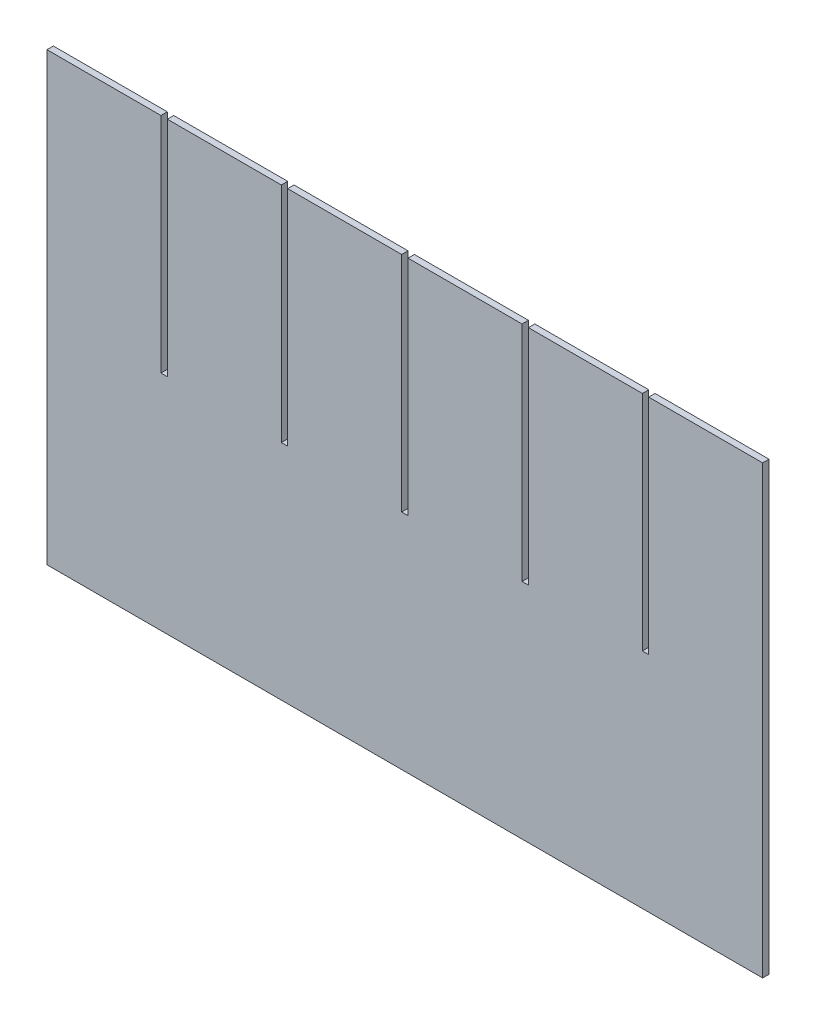
ISO-10303-21;
HEADER;
FILE_DESCRIPTION(('STEP AP214'),'2;1');
FILE_NAME('part.step','',(''),(''),'','','');
FILE_SCHEMA(('AUTOMOTIVE_DESIGN { 1 0 10303 214 1 1 1 1 }'));
ENDSEC;
DATA;
#1=APPLICATION_CONTEXT('core data for automotive mechanical design processes');
#2=APPLICATION_PROTOCOL_DEFINITION('international standard','automotive_design',2000,#1);
#3=PRODUCT_CONTEXT('',#1,'mechanical');
#4=PRODUCT('Part','Part','',(#3));
#5=PRODUCT_RELATED_PRODUCT_CATEGORY('part','',(#4));
#6=PRODUCT_DEFINITION_FORMATION('','',#4);
#7=PRODUCT_DEFINITION_CONTEXT('part definition',#1,'design');
#8=PRODUCT_DEFINITION('design','',#6,#7);
#9=PRODUCT_DEFINITION_SHAPE('','',#8);
#10=(LENGTH_UNIT() NAMED_UNIT(*) SI_UNIT(.MILLI.,.METRE.));
#11=(NAMED_UNIT(*) PLANE_ANGLE_UNIT() SI_UNIT($,.RADIAN.));
#12=(NAMED_UNIT(*) SI_UNIT($,.STERADIAN.) SOLID_ANGLE_UNIT());
#13=UNCERTAINTY_MEASURE_WITH_UNIT(LENGTH_MEASURE(1.E-05),#10,'distance_accuracy_value','');
#14=(GEOMETRIC_REPRESENTATION_CONTEXT(3) GLOBAL_UNCERTAINTY_ASSIGNED_CONTEXT((#13)) GLOBAL_UNIT_ASSIGNED_CONTEXT((#10,
#11,#12)) REPRESENTATION_CONTEXT('',''));
#15=CARTESIAN_POINT('',(0.,0.,0.));
#16=DIRECTION('',(0.,0.,1.));
#17=DIRECTION('',(1.,0.,0.));
#18=AXIS2_PLACEMENT_3D('',#15,#16,#17);
#19=CARTESIAN_POINT('',(-112.3,70.,2.));
#20=DIRECTION('',(0.,-1.,0.));
#21=DIRECTION('',(0.,0.,-1.));
#22=AXIS2_PLACEMENT_3D('',#19,#20,#21);
#23=PLANE('',#22);
#24=DIRECTION('',(0.,0.,1.));
#25=VECTOR('',#24,1.);
#26=CARTESIAN_POINT('',(-36.76,70.,0.));
#27=LINE('',#26,#25);
#28=CARTESIAN_POINT('',(-36.76,70.,0.));
#29=VERTEX_POINT('',#28);
#30=CARTESIAN_POINT('',(-36.76,70.,2.));
#31=VERTEX_POINT('',#30);
#32=EDGE_CURVE('E195',#29,#31,#27,.T.);
#33=ORIENTED_EDGE('',*,*,#32,.T.);
#34=DIRECTION('',(-1.,0.,0.));
#35=VECTOR('',#34,1.);
#36=CARTESIAN_POINT('',(-112.3,70.,2.));
#37=LINE('',#36,#35);
#38=CARTESIAN_POINT('',(-0.990000000000012,70.,2.));
#39=VERTEX_POINT('',#38);
#40=EDGE_CURVE('E404',#39,#31,#37,.T.);
#41=ORIENTED_EDGE('',*,*,#40,.F.);
#42=DIRECTION('',(0.,0.,1.));
#43=VECTOR('',#42,1.);
#44=CARTESIAN_POINT('',(-0.990000000000012,70.,0.));
#45=LINE('',#44,#43);
#46=CARTESIAN_POINT('',(-0.990000000000012,70.,0.));
#47=VERTEX_POINT('',#46);
#48=EDGE_CURVE('E217',#47,#39,#45,.T.);
#49=ORIENTED_EDGE('',*,*,#48,.F.);
#50=DIRECTION('',(-1.,0.,0.));
#51=VECTOR('',#50,1.);
#52=CARTESIAN_POINT('',(-112.3,70.,0.));
#53=LINE('',#52,#51);
#54=EDGE_CURVE('E211',#47,#29,#53,.T.);
#55=ORIENTED_EDGE('',*,*,#54,.T.);
#56=EDGE_LOOP('',(#33,#41,#49,#55));
#57=FACE_BOUND('',#56,.T.);
#58=ADVANCED_FACE('F33',(#57),#23,.F.);
#59=DIRECTION('',(0.,0.,1.));
#60=VECTOR('',#59,1.);
#61=CARTESIAN_POINT('',(1.00999999999999,70.,0.));
#62=LINE('',#61,#60);
#63=CARTESIAN_POINT('',(1.00999999999999,70.,0.));
#64=VERTEX_POINT('',#63);
#65=CARTESIAN_POINT('',(1.00999999999999,70.,2.));
#66=VERTEX_POINT('',#65);
#67=EDGE_CURVE('E365',#64,#66,#62,.T.);
#68=ORIENTED_EDGE('',*,*,#67,.T.);
#69=CARTESIAN_POINT('',(36.78,70.,2.));
#70=VERTEX_POINT('',#69);
#71=EDGE_CURVE('E405',#70,#66,#37,.T.);
#72=ORIENTED_EDGE('',*,*,#71,.F.);
#73=DIRECTION('',(0.,0.,1.));
#74=VECTOR('',#73,1.);
#75=CARTESIAN_POINT('',(36.78,70.,0.));
#76=LINE('',#75,#74);
#77=CARTESIAN_POINT('',(36.78,70.,0.));
#78=VERTEX_POINT('',#77);
#79=EDGE_CURVE('E314',#78,#70,#76,.T.);
#80=ORIENTED_EDGE('',*,*,#79,.F.);
#81=EDGE_CURVE('E218',#78,#64,#53,.T.);
#82=ORIENTED_EDGE('',*,*,#81,.T.);
#83=EDGE_LOOP('',(#68,#72,#80,#82));
#84=FACE_BOUND('',#83,.T.);
#85=ADVANCED_FACE('F430',(#84),#23,.F.);
#86=DIRECTION('',(0.,0.,1.));
#87=VECTOR('',#86,1.);
#88=CARTESIAN_POINT('',(76.55,70.,0.));
#89=LINE('',#88,#87);
#90=CARTESIAN_POINT('',(76.55,70.,0.));
#91=VERTEX_POINT('',#90);
#92=CARTESIAN_POINT('',(76.55,70.,2.));
#93=VERTEX_POINT('',#92);
#94=EDGE_CURVE('E339',#91,#93,#89,.T.);
#95=ORIENTED_EDGE('',*,*,#94,.T.);
#96=CARTESIAN_POINT('',(112.3,70.,2.));
#97=VERTEX_POINT('',#96);
#98=EDGE_CURVE('E270',#97,#93,#37,.T.);
#99=ORIENTED_EDGE('',*,*,#98,.F.);
#100=DIRECTION('',(0.,0.,-1.));
#101=VECTOR('',#100,1.);
#102=CARTESIAN_POINT('',(112.3,70.,2.));
#103=LINE('',#102,#101);
#104=CARTESIAN_POINT('',(112.3,70.,0.));
#105=VERTEX_POINT('',#104);
#106=EDGE_CURVE('E11',#97,#105,#103,.T.);
#107=ORIENTED_EDGE('',*,*,#106,.T.);
#108=EDGE_CURVE('E224',#105,#91,#53,.T.);
#109=ORIENTED_EDGE('',*,*,#108,.T.);
#110=EDGE_LOOP('',(#95,#99,#107,#109));
#111=FACE_BOUND('',#110,.T.);
#112=ADVANCED_FACE('F455',(#111),#23,.F.);
#113=CARTESIAN_POINT('',(74.55,70.,2.));
#114=VERTEX_POINT('',#113);
#115=CARTESIAN_POINT('',(38.78,70.,2.));
#116=VERTEX_POINT('',#115);
#117=EDGE_CURVE('E271',#114,#116,#37,.T.);
#118=ORIENTED_EDGE('',*,*,#117,.F.);
#119=DIRECTION('',(0.,0.,1.));
#120=VECTOR('',#119,1.);
#121=CARTESIAN_POINT('',(74.55,70.,0.));
#122=LINE('',#121,#120);
#123=CARTESIAN_POINT('',(74.55,70.,0.));
#124=VERTEX_POINT('',#123);
#125=EDGE_CURVE('E342',#124,#114,#122,.T.);
#126=ORIENTED_EDGE('',*,*,#125,.F.);
#127=CARTESIAN_POINT('',(38.78,70.,0.));
#128=VERTEX_POINT('',#127);
#129=EDGE_CURVE('E222',#124,#128,#53,.T.);
#130=ORIENTED_EDGE('',*,*,#129,.T.);
#131=DIRECTION('',(0.,0.,1.));
#132=VECTOR('',#131,1.);
#133=CARTESIAN_POINT('',(38.78,70.,0.));
#134=LINE('',#133,#132);
#135=EDGE_CURVE('E311',#128,#116,#134,.T.);
#136=ORIENTED_EDGE('',*,*,#135,.T.);
#137=EDGE_LOOP('',(#118,#126,#130,#136));
#138=FACE_BOUND('',#137,.T.);
#139=ADVANCED_FACE('F417',(#138),#23,.F.);
#140=CARTESIAN_POINT('',(0.,0.,2.));
#141=DIRECTION('',(0.,0.,-1.));
#142=DIRECTION('',(-1.,0.,0.));
#143=AXIS2_PLACEMENT_3D('',#140,#141,#142);
#144=PLANE('',#143);
#145=DIRECTION('',(0.,-1.,0.));
#146=VECTOR('',#145,1.);
#147=CARTESIAN_POINT('',(-36.76,0.,2.));
#148=LINE('',#147,#146);
#149=CARTESIAN_POINT('',(-36.76,0.,2.));
#150=VERTEX_POINT('',#149);
#151=EDGE_CURVE('E200',#31,#150,#148,.T.);
#152=ORIENTED_EDGE('',*,*,#151,.T.);
#153=DIRECTION('',(1.,0.,0.));
#154=VECTOR('',#153,1.);
#155=CARTESIAN_POINT('',(0.,0.,2.));
#156=LINE('',#155,#154);
#157=CARTESIAN_POINT('',(-38.76,0.,2.));
#158=VERTEX_POINT('',#157);
#159=EDGE_CURVE('E214',#158,#150,#156,.T.);
#160=ORIENTED_EDGE('',*,*,#159,.F.);
#161=DIRECTION('',(0.,-1.,0.));
#162=VECTOR('',#161,1.);
#163=CARTESIAN_POINT('',(-38.76,0.,2.));
#164=LINE('',#163,#162);
#165=CARTESIAN_POINT('',(-38.76,70.,2.));
#166=VERTEX_POINT('',#165);
#167=EDGE_CURVE('E388',#166,#158,#164,.T.);
#168=ORIENTED_EDGE('',*,*,#167,.F.);
#169=CARTESIAN_POINT('',(-74.53,70.,2.));
#170=VERTEX_POINT('',#169);
#171=EDGE_CURVE('E268',#166,#170,#37,.T.);
#172=ORIENTED_EDGE('',*,*,#171,.T.);
#173=DIRECTION('',(0.,-1.,0.));
#174=VECTOR('',#173,1.);
#175=CARTESIAN_POINT('',(-74.53,0.,2.));
#176=LINE('',#175,#174);
#177=CARTESIAN_POINT('',(-74.53,0.,2.));
#178=VERTEX_POINT('',#177);
#179=EDGE_CURVE('E297',#170,#178,#176,.T.);
#180=ORIENTED_EDGE('',*,*,#179,.T.);
#181=DIRECTION('',(1.,0.,0.));
#182=VECTOR('',#181,1.);
#183=CARTESIAN_POINT('',(0.,0.,2.));
#184=LINE('',#183,#182);
#185=CARTESIAN_POINT('',(-76.53,0.,2.));
#186=VERTEX_POINT('',#185);
#187=EDGE_CURVE('E292',#186,#178,#184,.T.);
#188=ORIENTED_EDGE('',*,*,#187,.F.);
#189=DIRECTION('',(0.,-1.,0.));
#190=VECTOR('',#189,1.);
#191=CARTESIAN_POINT('',(-76.53,0.,2.));
#192=LINE('',#191,#190);
#193=CARTESIAN_POINT('',(-76.53,70.,2.));
#194=VERTEX_POINT('',#193);
#195=EDGE_CURVE('E280',#194,#186,#192,.T.);
#196=ORIENTED_EDGE('',*,*,#195,.F.);
#197=CARTESIAN_POINT('',(-112.3,70.,2.));
#198=VERTEX_POINT('',#197);
#199=EDGE_CURVE('E266',#194,#198,#37,.T.);
#200=ORIENTED_EDGE('',*,*,#199,.T.);
#201=DIRECTION('',(0.,-1.,0.));
#202=VECTOR('',#201,1.);
#203=CARTESIAN_POINT('',(-112.3,-70.,2.));
#204=LINE('',#203,#202);
#205=CARTESIAN_POINT('',(-112.3,-70.,2.));
#206=VERTEX_POINT('',#205);
#207=EDGE_CURVE('E248',#198,#206,#204,.T.);
#208=ORIENTED_EDGE('',*,*,#207,.T.);
#209=DIRECTION('',(1.,0.,0.));
#210=VECTOR('',#209,1.);
#211=CARTESIAN_POINT('',(-112.3,-70.,2.));
#212=LINE('',#211,#210);
#213=CARTESIAN_POINT('',(112.3,-70.,2.));
#214=VERTEX_POINT('',#213);
#215=EDGE_CURVE('E239',#206,#214,#212,.T.);
#216=ORIENTED_EDGE('',*,*,#215,.T.);
#217=DIRECTION('',(0.,1.,0.));
#218=VECTOR('',#217,1.);
#219=CARTESIAN_POINT('',(112.3,-70.,2.));
#220=LINE('',#219,#218);
#221=EDGE_CURVE('E234',#214,#97,#220,.T.);
#222=ORIENTED_EDGE('',*,*,#221,.T.);
#223=ORIENTED_EDGE('',*,*,#98,.T.);
#224=DIRECTION('',(0.,-1.,0.));
#225=VECTOR('',#224,1.);
#226=CARTESIAN_POINT('',(76.55,0.,2.));
#227=LINE('',#226,#225);
#228=CARTESIAN_POINT('',(76.55,0.,2.));
#229=VERTEX_POINT('',#228);
#230=EDGE_CURVE('E345',#93,#229,#227,.T.);
#231=ORIENTED_EDGE('',*,*,#230,.T.);
#232=DIRECTION('',(1.,0.,0.));
#233=VECTOR('',#232,1.);
#234=CARTESIAN_POINT('',(0.,0.,2.));
#235=LINE('',#234,#233);
#236=CARTESIAN_POINT('',(74.55,0.,2.));
#237=VERTEX_POINT('',#236);
#238=EDGE_CURVE('E349',#237,#229,#235,.T.);
#239=ORIENTED_EDGE('',*,*,#238,.F.);
#240=DIRECTION('',(0.,-1.,0.));
#241=VECTOR('',#240,1.);
#242=CARTESIAN_POINT('',(74.55,0.,2.));
#243=LINE('',#242,#241);
#244=EDGE_CURVE('E316',#114,#237,#243,.T.);
#245=ORIENTED_EDGE('',*,*,#244,.F.);
#246=ORIENTED_EDGE('',*,*,#117,.T.);
#247=DIRECTION('',(0.,-1.,0.));
#248=VECTOR('',#247,1.);
#249=CARTESIAN_POINT('',(38.78,0.,2.));
#250=LINE('',#249,#248);
#251=CARTESIAN_POINT('',(38.78,0.,2.));
#252=VERTEX_POINT('',#251);
#253=EDGE_CURVE('E317',#116,#252,#250,.T.);
#254=ORIENTED_EDGE('',*,*,#253,.T.);
#255=DIRECTION('',(1.,0.,0.));
#256=VECTOR('',#255,1.);
#257=CARTESIAN_POINT('',(0.,0.,2.));
#258=LINE('',#257,#256);
#259=CARTESIAN_POINT('',(36.78,0.,2.));
#260=VERTEX_POINT('',#259);
#261=EDGE_CURVE('E321',#260,#252,#258,.T.);
#262=ORIENTED_EDGE('',*,*,#261,.F.);
#263=DIRECTION('',(0.,-1.,0.));
#264=VECTOR('',#263,1.);
#265=CARTESIAN_POINT('',(36.78,0.,2.));
#266=LINE('',#265,#264);
#267=EDGE_CURVE('E324',#70,#260,#266,.T.);
#268=ORIENTED_EDGE('',*,*,#267,.F.);
#269=ORIENTED_EDGE('',*,*,#71,.T.);
#270=DIRECTION('',(0.,-1.,0.));
#271=VECTOR('',#270,1.);
#272=CARTESIAN_POINT('',(1.01,0.,2.));
#273=LINE('',#272,#271);
#274=CARTESIAN_POINT('',(1.01,0.,2.));
#275=VERTEX_POINT('',#274);
#276=EDGE_CURVE('E369',#66,#275,#273,.T.);
#277=ORIENTED_EDGE('',*,*,#276,.T.);
#278=DIRECTION('',(1.,0.,0.));
#279=VECTOR('',#278,1.);
#280=CARTESIAN_POINT('',(0.,0.,2.));
#281=LINE('',#280,#279);
#282=CARTESIAN_POINT('',(-0.990000000000005,0.,2.));
#283=VERTEX_POINT('',#282);
#284=EDGE_CURVE('E373',#283,#275,#281,.T.);
#285=ORIENTED_EDGE('',*,*,#284,.F.);
#286=DIRECTION('',(0.,-1.,0.));
#287=VECTOR('',#286,1.);
#288=CARTESIAN_POINT('',(-0.990000000000005,0.,2.));
#289=LINE('',#288,#287);
#290=EDGE_CURVE('E344',#39,#283,#289,.T.);
#291=ORIENTED_EDGE('',*,*,#290,.F.);
#292=ORIENTED_EDGE('',*,*,#40,.T.);
#293=EDGE_LOOP('',(#152,#160,#168,#172,#180,#188,#196,#200,#208,#216,#222,#223,#231,#239,#245,
#246,#254,#262,#268,#269,#277,#285,#291,#292));
#294=FACE_BOUND('',#293,.T.);
#295=ADVANCED_FACE('F276',(#294),#144,.F.);
#296=CARTESIAN_POINT('',(0.,0.,0.));
#297=DIRECTION('',(0.,0.,-1.));
#298=DIRECTION('',(-1.,0.,0.));
#299=AXIS2_PLACEMENT_3D('',#296,#297,#298);
#300=PLANE('',#299);
#301=DIRECTION('',(1.,0.,0.));
#302=VECTOR('',#301,1.);
#303=CARTESIAN_POINT('',(0.,0.,0.));
#304=LINE('',#303,#302);
#305=CARTESIAN_POINT('',(-38.76,0.,0.));
#306=VERTEX_POINT('',#305);
#307=CARTESIAN_POINT('',(-36.76,0.,0.));
#308=VERTEX_POINT('',#307);
#309=EDGE_CURVE('E48',#306,#308,#304,.T.);
#310=ORIENTED_EDGE('',*,*,#309,.T.);
#311=DIRECTION('',(0.,-1.,0.));
#312=VECTOR('',#311,1.);
#313=CARTESIAN_POINT('',(-36.76,0.,0.));
#314=LINE('',#313,#312);
#315=EDGE_CURVE('E198',#29,#308,#314,.T.);
#316=ORIENTED_EDGE('',*,*,#315,.F.);
#317=ORIENTED_EDGE('',*,*,#54,.F.);
#318=DIRECTION('',(0.,-1.,0.));
#319=VECTOR('',#318,1.);
#320=CARTESIAN_POINT('',(-0.990000000000005,0.,0.));
#321=LINE('',#320,#319);
#322=CARTESIAN_POINT('',(-0.990000000000005,0.,0.));
#323=VERTEX_POINT('',#322);
#324=EDGE_CURVE('E372',#47,#323,#321,.T.);
#325=ORIENTED_EDGE('',*,*,#324,.T.);
#326=DIRECTION('',(1.,0.,0.));
#327=VECTOR('',#326,1.);
#328=CARTESIAN_POINT('',(0.,0.,0.));
#329=LINE('',#328,#327);
#330=CARTESIAN_POINT('',(1.01,0.,0.));
#331=VERTEX_POINT('',#330);
#332=EDGE_CURVE('E378',#323,#331,#329,.T.);
#333=ORIENTED_EDGE('',*,*,#332,.T.);
#334=DIRECTION('',(0.,-1.,0.));
#335=VECTOR('',#334,1.);
#336=CARTESIAN_POINT('',(1.01,0.,0.));
#337=LINE('',#336,#335);
#338=EDGE_CURVE('E363',#64,#331,#337,.T.);
#339=ORIENTED_EDGE('',*,*,#338,.F.);
#340=ORIENTED_EDGE('',*,*,#81,.F.);
#341=DIRECTION('',(0.,-1.,0.));
#342=VECTOR('',#341,1.);
#343=CARTESIAN_POINT('',(36.78,0.,0.));
#344=LINE('',#343,#342);
#345=CARTESIAN_POINT('',(36.78,0.,0.));
#346=VERTEX_POINT('',#345);
#347=EDGE_CURVE('E320',#78,#346,#344,.T.);
#348=ORIENTED_EDGE('',*,*,#347,.T.);
#349=DIRECTION('',(1.,0.,0.));
#350=VECTOR('',#349,1.);
#351=CARTESIAN_POINT('',(0.,0.,0.));
#352=LINE('',#351,#350);
#353=CARTESIAN_POINT('',(38.78,0.,0.));
#354=VERTEX_POINT('',#353);
#355=EDGE_CURVE('E329',#346,#354,#352,.T.);
#356=ORIENTED_EDGE('',*,*,#355,.T.);
#357=DIRECTION('',(0.,-1.,0.));
#358=VECTOR('',#357,1.);
#359=CARTESIAN_POINT('',(38.78,0.,0.));
#360=LINE('',#359,#358);
#361=EDGE_CURVE('E309',#128,#354,#360,.T.);
#362=ORIENTED_EDGE('',*,*,#361,.F.);
#363=ORIENTED_EDGE('',*,*,#129,.F.);
#364=DIRECTION('',(0.,-1.,0.));
#365=VECTOR('',#364,1.);
#366=CARTESIAN_POINT('',(74.55,0.,0.));
#367=LINE('',#366,#365);
#368=CARTESIAN_POINT('',(74.55,0.,0.));
#369=VERTEX_POINT('',#368);
#370=EDGE_CURVE('E348',#124,#369,#367,.T.);
#371=ORIENTED_EDGE('',*,*,#370,.T.);
#372=DIRECTION('',(1.,0.,0.));
#373=VECTOR('',#372,1.);
#374=CARTESIAN_POINT('',(0.,0.,0.));
#375=LINE('',#374,#373);
#376=CARTESIAN_POINT('',(76.55,0.,0.));
#377=VERTEX_POINT('',#376);
#378=EDGE_CURVE('E356',#369,#377,#375,.T.);
#379=ORIENTED_EDGE('',*,*,#378,.T.);
#380=DIRECTION('',(0.,-1.,0.));
#381=VECTOR('',#380,1.);
#382=CARTESIAN_POINT('',(76.55,0.,0.));
#383=LINE('',#382,#381);
#384=EDGE_CURVE('E337',#91,#377,#383,.T.);
#385=ORIENTED_EDGE('',*,*,#384,.F.);
#386=ORIENTED_EDGE('',*,*,#108,.F.);
#387=DIRECTION('',(0.,1.,0.));
#388=VECTOR('',#387,1.);
#389=CARTESIAN_POINT('',(112.3,-70.,0.));
#390=LINE('',#389,#388);
#391=CARTESIAN_POINT('',(112.3,-70.,0.));
#392=VERTEX_POINT('',#391);
#393=EDGE_CURVE('E229',#392,#105,#390,.T.);
#394=ORIENTED_EDGE('',*,*,#393,.F.);
#395=DIRECTION('',(1.,0.,0.));
#396=VECTOR('',#395,1.);
#397=CARTESIAN_POINT('',(-112.3,-70.,0.));
#398=LINE('',#397,#396);
#399=CARTESIAN_POINT('',(-112.3,-70.,0.));
#400=VERTEX_POINT('',#399);
#401=EDGE_CURVE('E232',#400,#392,#398,.T.);
#402=ORIENTED_EDGE('',*,*,#401,.F.);
#403=DIRECTION('',(0.,-1.,0.));
#404=VECTOR('',#403,1.);
#405=CARTESIAN_POINT('',(-112.3,-70.,0.));
#406=LINE('',#405,#404);
#407=CARTESIAN_POINT('',(-112.3,70.,0.));
#408=VERTEX_POINT('',#407);
#409=EDGE_CURVE('E228',#408,#400,#406,.T.);
#410=ORIENTED_EDGE('',*,*,#409,.F.);
#411=CARTESIAN_POINT('',(-76.53,70.,0.));
#412=VERTEX_POINT('',#411);
#413=EDGE_CURVE('E223',#412,#408,#53,.T.);
#414=ORIENTED_EDGE('',*,*,#413,.F.);
#415=DIRECTION('',(0.,-1.,0.));
#416=VECTOR('',#415,1.);
#417=CARTESIAN_POINT('',(-76.53,0.,0.));
#418=LINE('',#417,#416);
#419=CARTESIAN_POINT('',(-76.53,0.,0.));
#420=VERTEX_POINT('',#419);
#421=EDGE_CURVE('E303',#412,#420,#418,.T.);
#422=ORIENTED_EDGE('',*,*,#421,.T.);
#423=DIRECTION('',(1.,0.,0.));
#424=VECTOR('',#423,1.);
#425=CARTESIAN_POINT('',(0.,0.,0.));
#426=LINE('',#425,#424);
#427=CARTESIAN_POINT('',(-74.53,0.,0.));
#428=VERTEX_POINT('',#427);
#429=EDGE_CURVE('E289',#420,#428,#426,.T.);
#430=ORIENTED_EDGE('',*,*,#429,.T.);
#431=DIRECTION('',(0.,-1.,0.));
#432=VECTOR('',#431,1.);
#433=CARTESIAN_POINT('',(-74.53,0.,0.));
#434=LINE('',#433,#432);
#435=CARTESIAN_POINT('',(-74.53,70.,0.));
#436=VERTEX_POINT('',#435);
#437=EDGE_CURVE('E295',#436,#428,#434,.T.);
#438=ORIENTED_EDGE('',*,*,#437,.F.);
#439=CARTESIAN_POINT('',(-38.76,70.,0.));
#440=VERTEX_POINT('',#439);
#441=EDGE_CURVE('E219',#440,#436,#53,.T.);
#442=ORIENTED_EDGE('',*,*,#441,.F.);
#443=DIRECTION('',(0.,-1.,0.));
#444=VECTOR('',#443,1.);
#445=CARTESIAN_POINT('',(-38.76,0.,0.));
#446=LINE('',#445,#444);
#447=EDGE_CURVE('E213',#440,#306,#446,.T.);
#448=ORIENTED_EDGE('',*,*,#447,.T.);
#449=EDGE_LOOP('',(#310,#316,#317,#325,#333,#339,#340,#348,#356,#362,#363,#371,#379,#385,#386,
#394,#402,#410,#414,#422,#430,#438,#442,#448));
#450=FACE_BOUND('',#449,.T.);
#451=ADVANCED_FACE('F209',(#450),#300,.T.);
#452=ORIENTED_EDGE('',*,*,#171,.F.);
#453=DIRECTION('',(0.,0.,1.));
#454=VECTOR('',#453,1.);
#455=CARTESIAN_POINT('',(-38.76,70.,0.));
#456=LINE('',#455,#454);
#457=EDGE_CURVE('E205',#440,#166,#456,.T.);
#458=ORIENTED_EDGE('',*,*,#457,.F.);
#459=ORIENTED_EDGE('',*,*,#441,.T.);
#460=DIRECTION('',(0.,0.,1.));
#461=VECTOR('',#460,1.);
#462=CARTESIAN_POINT('',(-74.53,70.,0.));
#463=LINE('',#462,#461);
#464=EDGE_CURVE('E273',#436,#170,#463,.T.);
#465=ORIENTED_EDGE('',*,*,#464,.T.);
#466=EDGE_LOOP('',(#452,#458,#459,#465));
#467=FACE_BOUND('',#466,.T.);
#468=ADVANCED_FACE('F401',(#467),#23,.F.);
#469=CARTESIAN_POINT('',(112.3,-70.,2.));
#470=DIRECTION('',(-1.,0.,0.));
#471=DIRECTION('',(0.,0.,1.));
#472=AXIS2_PLACEMENT_3D('',#469,#470,#471);
#473=PLANE('',#472);
#474=ORIENTED_EDGE('',*,*,#393,.T.);
#475=ORIENTED_EDGE('',*,*,#106,.F.);
#476=ORIENTED_EDGE('',*,*,#221,.F.);
#477=DIRECTION('',(0.,0.,-1.));
#478=VECTOR('',#477,1.);
#479=CARTESIAN_POINT('',(112.3,-70.,2.));
#480=LINE('',#479,#478);
#481=EDGE_CURVE('E235',#214,#392,#480,.T.);
#482=ORIENTED_EDGE('',*,*,#481,.T.);
#483=EDGE_LOOP('',(#474,#475,#476,#482));
#484=FACE_BOUND('',#483,.T.);
#485=ADVANCED_FACE('F35',(#484),#473,.F.);
#486=ORIENTED_EDGE('',*,*,#199,.F.);
#487=DIRECTION('',(0.,0.,1.));
#488=VECTOR('',#487,1.);
#489=CARTESIAN_POINT('',(-76.53,70.,0.));
#490=LINE('',#489,#488);
#491=EDGE_CURVE('E283',#412,#194,#490,.T.);
#492=ORIENTED_EDGE('',*,*,#491,.F.);
#493=ORIENTED_EDGE('',*,*,#413,.T.);
#494=DIRECTION('',(0.,0.,-1.));
#495=VECTOR('',#494,1.);
#496=CARTESIAN_POINT('',(-112.3,70.,2.));
#497=LINE('',#496,#495);
#498=EDGE_CURVE('E41',#198,#408,#497,.T.);
#499=ORIENTED_EDGE('',*,*,#498,.F.);
#500=EDGE_LOOP('',(#486,#492,#493,#499));
#501=FACE_BOUND('',#500,.T.);
#502=ADVANCED_FACE('F282',(#501),#23,.F.);
#503=CARTESIAN_POINT('',(-112.3,-70.,2.));
#504=DIRECTION('',(1.,0.,0.));
#505=DIRECTION('',(0.,0.,-1.));
#506=AXIS2_PLACEMENT_3D('',#503,#504,#505);
#507=PLANE('',#506);
#508=ORIENTED_EDGE('',*,*,#409,.T.);
#509=DIRECTION('',(0.,0.,-1.));
#510=VECTOR('',#509,1.);
#511=CARTESIAN_POINT('',(-112.3,-70.,2.));
#512=LINE('',#511,#510);
#513=EDGE_CURVE('E238',#206,#400,#512,.T.);
#514=ORIENTED_EDGE('',*,*,#513,.F.);
#515=ORIENTED_EDGE('',*,*,#207,.F.);
#516=ORIENTED_EDGE('',*,*,#498,.T.);
#517=EDGE_LOOP('',(#508,#514,#515,#516));
#518=FACE_BOUND('',#517,.T.);
#519=ADVANCED_FACE('F246',(#518),#507,.F.);
#520=CARTESIAN_POINT('',(-112.3,-70.,2.));
#521=DIRECTION('',(0.,1.,0.));
#522=DIRECTION('',(0.,0.,1.));
#523=AXIS2_PLACEMENT_3D('',#520,#521,#522);
#524=PLANE('',#523);
#525=ORIENTED_EDGE('',*,*,#401,.T.);
#526=ORIENTED_EDGE('',*,*,#481,.F.);
#527=ORIENTED_EDGE('',*,*,#215,.F.);
#528=ORIENTED_EDGE('',*,*,#513,.T.);
#529=EDGE_LOOP('',(#525,#526,#527,#528));
#530=FACE_BOUND('',#529,.T.);
#531=ADVANCED_FACE('F258',(#530),#524,.F.);
#532=CARTESIAN_POINT('',(-74.53,0.,0.));
#533=DIRECTION('',(-1.,0.,0.));
#534=DIRECTION('',(0.,-1.,0.));
#535=AXIS2_PLACEMENT_3D('',#532,#533,#534);
#536=PLANE('',#535);
#537=ORIENTED_EDGE('',*,*,#179,.F.);
#538=ORIENTED_EDGE('',*,*,#464,.F.);
#539=ORIENTED_EDGE('',*,*,#437,.T.);
#540=DIRECTION('',(0.,0.,1.));
#541=VECTOR('',#540,1.);
#542=CARTESIAN_POINT('',(-74.53,0.,0.));
#543=LINE('',#542,#541);
#544=EDGE_CURVE('E286',#428,#178,#543,.T.);
#545=ORIENTED_EDGE('',*,*,#544,.T.);
#546=EDGE_LOOP('',(#537,#538,#539,#545));
#547=FACE_BOUND('',#546,.T.);
#548=ADVANCED_FACE('F498',(#547),#536,.T.);
#549=CARTESIAN_POINT('',(0.,0.,0.));
#550=DIRECTION('',(0.,-1.,0.));
#551=DIRECTION('',(0.,0.,-1.));
#552=AXIS2_PLACEMENT_3D('',#549,#550,#551);
#553=PLANE('',#552);
#554=ORIENTED_EDGE('',*,*,#187,.T.);
#555=ORIENTED_EDGE('',*,*,#544,.F.);
#556=ORIENTED_EDGE('',*,*,#429,.F.);
#557=DIRECTION('',(0.,0.,1.));
#558=VECTOR('',#557,1.);
#559=CARTESIAN_POINT('',(-76.53,0.,0.));
#560=LINE('',#559,#558);
#561=EDGE_CURVE('E285',#420,#186,#560,.T.);
#562=ORIENTED_EDGE('',*,*,#561,.T.);
#563=EDGE_LOOP('',(#554,#555,#556,#562));
#564=FACE_BOUND('',#563,.T.);
#565=ADVANCED_FACE('F495',(#564),#553,.F.);
#566=CARTESIAN_POINT('',(-76.53,0.,0.));
#567=DIRECTION('',(-1.,0.,0.));
#568=DIRECTION('',(0.,-1.,0.));
#569=AXIS2_PLACEMENT_3D('',#566,#567,#568);
#570=PLANE('',#569);
#571=ORIENTED_EDGE('',*,*,#195,.T.);
#572=ORIENTED_EDGE('',*,*,#561,.F.);
#573=ORIENTED_EDGE('',*,*,#421,.F.);
#574=ORIENTED_EDGE('',*,*,#491,.T.);
#575=EDGE_LOOP('',(#571,#572,#573,#574));
#576=FACE_BOUND('',#575,.T.);
#577=ADVANCED_FACE('F494',(#576),#570,.F.);
#578=CARTESIAN_POINT('',(36.78,0.,0.));
#579=DIRECTION('',(-1.,0.,0.));
#580=DIRECTION('',(0.,-1.,0.));
#581=AXIS2_PLACEMENT_3D('',#578,#579,#580);
#582=PLANE('',#581);
#583=ORIENTED_EDGE('',*,*,#267,.T.);
#584=DIRECTION('',(0.,0.,1.));
#585=VECTOR('',#584,1.);
#586=CARTESIAN_POINT('',(36.78,0.,0.));
#587=LINE('',#586,#585);
#588=EDGE_CURVE('E306',#346,#260,#587,.T.);
#589=ORIENTED_EDGE('',*,*,#588,.F.);
#590=ORIENTED_EDGE('',*,*,#347,.F.);
#591=ORIENTED_EDGE('',*,*,#79,.T.);
#592=EDGE_LOOP('',(#583,#589,#590,#591));
#593=FACE_BOUND('',#592,.T.);
#594=ADVANCED_FACE('F490',(#593),#582,.F.);
#595=CARTESIAN_POINT('',(38.78,0.,0.));
#596=DIRECTION('',(-1.,0.,0.));
#597=DIRECTION('',(0.,-1.,0.));
#598=AXIS2_PLACEMENT_3D('',#595,#596,#597);
#599=PLANE('',#598);
#600=ORIENTED_EDGE('',*,*,#253,.F.);
#601=ORIENTED_EDGE('',*,*,#135,.F.);
#602=ORIENTED_EDGE('',*,*,#361,.T.);
#603=DIRECTION('',(0.,0.,1.));
#604=VECTOR('',#603,1.);
#605=CARTESIAN_POINT('',(38.78,0.,0.));
#606=LINE('',#605,#604);
#607=EDGE_CURVE('E308',#354,#252,#606,.T.);
#608=ORIENTED_EDGE('',*,*,#607,.T.);
#609=EDGE_LOOP('',(#600,#601,#602,#608));
#610=FACE_BOUND('',#609,.T.);
#611=ADVANCED_FACE('F422',(#610),#599,.T.);
#612=CARTESIAN_POINT('',(0.,0.,0.));
#613=DIRECTION('',(0.,-1.,0.));
#614=DIRECTION('',(0.,0.,-1.));
#615=AXIS2_PLACEMENT_3D('',#612,#613,#614);
#616=PLANE('',#615);
#617=ORIENTED_EDGE('',*,*,#261,.T.);
#618=ORIENTED_EDGE('',*,*,#607,.F.);
#619=ORIENTED_EDGE('',*,*,#355,.F.);
#620=ORIENTED_EDGE('',*,*,#588,.T.);
#621=EDGE_LOOP('',(#617,#618,#619,#620));
#622=FACE_BOUND('',#621,.T.);
#623=ADVANCED_FACE('F426',(#622),#616,.F.);
#624=CARTESIAN_POINT('',(74.55,0.,0.));
#625=DIRECTION('',(-1.,0.,0.));
#626=DIRECTION('',(0.,-1.,0.));
#627=AXIS2_PLACEMENT_3D('',#624,#625,#626);
#628=PLANE('',#627);
#629=ORIENTED_EDGE('',*,*,#244,.T.);
#630=DIRECTION('',(0.,0.,1.));
#631=VECTOR('',#630,1.);
#632=CARTESIAN_POINT('',(74.55,0.,0.));
#633=LINE('',#632,#631);
#634=EDGE_CURVE('E334',#369,#237,#633,.T.);
#635=ORIENTED_EDGE('',*,*,#634,.F.);
#636=ORIENTED_EDGE('',*,*,#370,.F.);
#637=ORIENTED_EDGE('',*,*,#125,.T.);
#638=EDGE_LOOP('',(#629,#635,#636,#637));
#639=FACE_BOUND('',#638,.T.);
#640=ADVANCED_FACE('F480',(#639),#628,.F.);
#641=CARTESIAN_POINT('',(76.55,0.,0.));
#642=DIRECTION('',(-1.,0.,0.));
#643=DIRECTION('',(0.,-1.,0.));
#644=AXIS2_PLACEMENT_3D('',#641,#642,#643);
#645=PLANE('',#644);
#646=ORIENTED_EDGE('',*,*,#230,.F.);
#647=ORIENTED_EDGE('',*,*,#94,.F.);
#648=ORIENTED_EDGE('',*,*,#384,.T.);
#649=DIRECTION('',(0.,0.,1.));
#650=VECTOR('',#649,1.);
#651=CARTESIAN_POINT('',(76.55,0.,0.));
#652=LINE('',#651,#650);
#653=EDGE_CURVE('E336',#377,#229,#652,.T.);
#654=ORIENTED_EDGE('',*,*,#653,.T.);
#655=EDGE_LOOP('',(#646,#647,#648,#654));
#656=FACE_BOUND('',#655,.T.);
#657=ADVANCED_FACE('F446',(#656),#645,.T.);
#658=CARTESIAN_POINT('',(0.,0.,0.));
#659=DIRECTION('',(0.,-1.,0.));
#660=DIRECTION('',(0.,0.,-1.));
#661=AXIS2_PLACEMENT_3D('',#658,#659,#660);
#662=PLANE('',#661);
#663=ORIENTED_EDGE('',*,*,#238,.T.);
#664=ORIENTED_EDGE('',*,*,#653,.F.);
#665=ORIENTED_EDGE('',*,*,#378,.F.);
#666=ORIENTED_EDGE('',*,*,#634,.T.);
#667=EDGE_LOOP('',(#663,#664,#665,#666));
#668=FACE_BOUND('',#667,.T.);
#669=ADVANCED_FACE('F439',(#668),#662,.F.);
#670=CARTESIAN_POINT('',(-0.990000000000005,0.,0.));
#671=DIRECTION('',(-1.,0.,0.));
#672=DIRECTION('',(0.,-1.,0.));
#673=AXIS2_PLACEMENT_3D('',#670,#671,#672);
#674=PLANE('',#673);
#675=ORIENTED_EDGE('',*,*,#290,.T.);
#676=DIRECTION('',(0.,0.,1.));
#677=VECTOR('',#676,1.);
#678=CARTESIAN_POINT('',(-0.990000000000005,0.,0.));
#679=LINE('',#678,#677);
#680=EDGE_CURVE('E361',#323,#283,#679,.T.);
#681=ORIENTED_EDGE('',*,*,#680,.F.);
#682=ORIENTED_EDGE('',*,*,#324,.F.);
#683=ORIENTED_EDGE('',*,*,#48,.T.);
#684=EDGE_LOOP('',(#675,#681,#682,#683));
#685=FACE_BOUND('',#684,.T.);
#686=ADVANCED_FACE('F437',(#685),#674,.F.);
#687=CARTESIAN_POINT('',(1.01,0.,0.));
#688=DIRECTION('',(-1.,0.,0.));
#689=DIRECTION('',(0.,-1.,0.));
#690=AXIS2_PLACEMENT_3D('',#687,#688,#689);
#691=PLANE('',#690);
#692=ORIENTED_EDGE('',*,*,#276,.F.);
#693=ORIENTED_EDGE('',*,*,#67,.F.);
#694=ORIENTED_EDGE('',*,*,#338,.T.);
#695=DIRECTION('',(0.,0.,1.));
#696=VECTOR('',#695,1.);
#697=CARTESIAN_POINT('',(1.01,0.,0.));
#698=LINE('',#697,#696);
#699=EDGE_CURVE('E56',#331,#275,#698,.T.);
#700=ORIENTED_EDGE('',*,*,#699,.T.);
#701=EDGE_LOOP('',(#692,#693,#694,#700));
#702=FACE_BOUND('',#701,.T.);
#703=ADVANCED_FACE('F433',(#702),#691,.T.);
#704=CARTESIAN_POINT('',(0.,0.,0.));
#705=DIRECTION('',(0.,-1.,0.));
#706=DIRECTION('',(0.,0.,-1.));
#707=AXIS2_PLACEMENT_3D('',#704,#705,#706);
#708=PLANE('',#707);
#709=ORIENTED_EDGE('',*,*,#284,.T.);
#710=ORIENTED_EDGE('',*,*,#699,.F.);
#711=ORIENTED_EDGE('',*,*,#332,.F.);
#712=ORIENTED_EDGE('',*,*,#680,.T.);
#713=EDGE_LOOP('',(#709,#710,#711,#712));
#714=FACE_BOUND('',#713,.T.);
#715=ADVANCED_FACE('F434',(#714),#708,.F.);
#716=CARTESIAN_POINT('',(-36.76,0.,0.));
#717=DIRECTION('',(-1.,0.,0.));
#718=DIRECTION('',(0.,-1.,0.));
#719=AXIS2_PLACEMENT_3D('',#716,#717,#718);
#720=PLANE('',#719);
#721=ORIENTED_EDGE('',*,*,#151,.F.);
#722=ORIENTED_EDGE('',*,*,#32,.F.);
#723=ORIENTED_EDGE('',*,*,#315,.T.);
#724=DIRECTION('',(0.,0.,1.));
#725=VECTOR('',#724,1.);
#726=CARTESIAN_POINT('',(-36.76,0.,0.));
#727=LINE('',#726,#725);
#728=EDGE_CURVE('E300',#308,#150,#727,.T.);
#729=ORIENTED_EDGE('',*,*,#728,.T.);
#730=EDGE_LOOP('',(#721,#722,#723,#729));
#731=FACE_BOUND('',#730,.T.);
#732=ADVANCED_FACE('F197',(#731),#720,.T.);
#733=CARTESIAN_POINT('',(0.,0.,0.));
#734=DIRECTION('',(0.,-1.,0.));
#735=DIRECTION('',(0.,0.,-1.));
#736=AXIS2_PLACEMENT_3D('',#733,#734,#735);
#737=PLANE('',#736);
#738=ORIENTED_EDGE('',*,*,#159,.T.);
#739=ORIENTED_EDGE('',*,*,#728,.F.);
#740=ORIENTED_EDGE('',*,*,#309,.F.);
#741=DIRECTION('',(0.,0.,1.));
#742=VECTOR('',#741,1.);
#743=CARTESIAN_POINT('',(-38.76,0.,0.));
#744=LINE('',#743,#742);
#745=EDGE_CURVE('E383',#306,#158,#744,.T.);
#746=ORIENTED_EDGE('',*,*,#745,.T.);
#747=EDGE_LOOP('',(#738,#739,#740,#746));
#748=FACE_BOUND('',#747,.T.);
#749=ADVANCED_FACE('F576',(#748),#737,.F.);
#750=CARTESIAN_POINT('',(-38.76,0.,0.));
#751=DIRECTION('',(-1.,0.,0.));
#752=DIRECTION('',(0.,-1.,0.));
#753=AXIS2_PLACEMENT_3D('',#750,#751,#752);
#754=PLANE('',#753);
#755=ORIENTED_EDGE('',*,*,#167,.T.);
#756=ORIENTED_EDGE('',*,*,#745,.F.);
#757=ORIENTED_EDGE('',*,*,#447,.F.);
#758=ORIENTED_EDGE('',*,*,#457,.T.);
#759=EDGE_LOOP('',(#755,#756,#757,#758));
#760=FACE_BOUND('',#759,.T.);
#761=ADVANCED_FACE('F397',(#760),#754,.F.);
#762=CLOSED_SHELL('',(#58,#85,#112,#139,#295,#451,#468,#485,#502,#519,#531,#548,#565,#577,#594,
#611,#623,#640,#657,#669,#686,#703,#715,#732,#749,#761));
#763=MANIFOLD_SOLID_BREP('B2',#762);
#764=ADVANCED_BREP_SHAPE_REPRESENTATION('',(#18,#763),#14);
#765=SHAPE_DEFINITION_REPRESENTATION(#9,#764);
ENDSEC;
END-ISO-10303-21;
